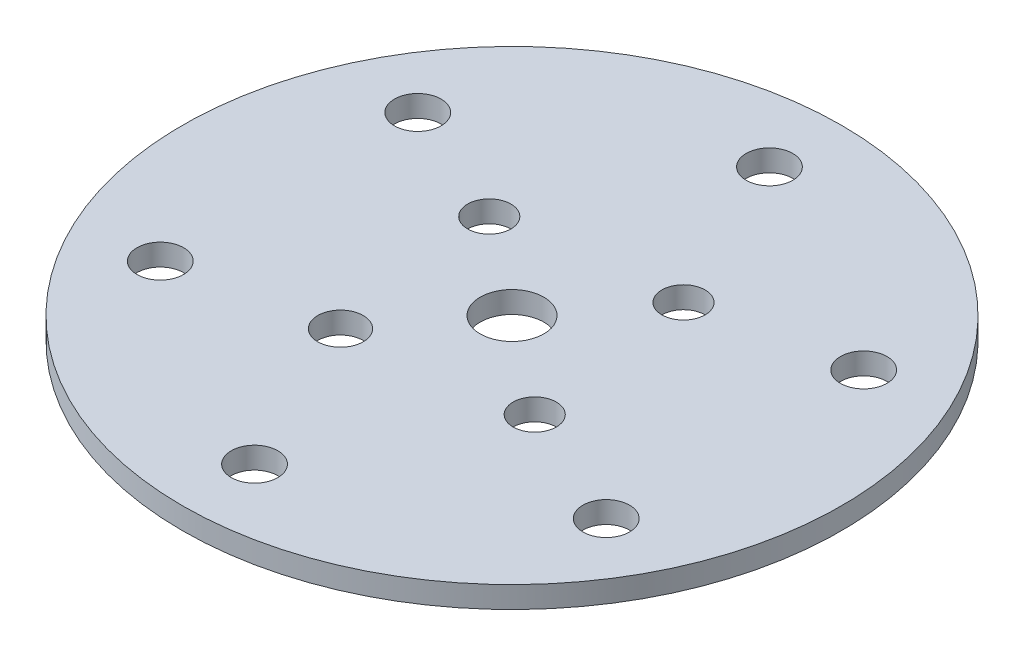
ISO-10303-21;
HEADER;
FILE_DESCRIPTION(('STEP AP214'),'2;1');
FILE_NAME('part.step','',(''),(''),'','','');
FILE_SCHEMA(('AUTOMOTIVE_DESIGN { 1 0 10303 214 1 1 1 1 }'));
ENDSEC;
DATA;
#1=APPLICATION_CONTEXT('core data for automotive mechanical design processes');
#2=APPLICATION_PROTOCOL_DEFINITION('international standard','automotive_design',2000,#1);
#3=PRODUCT_CONTEXT('',#1,'mechanical');
#4=PRODUCT('Part','Part','',(#3));
#5=PRODUCT_RELATED_PRODUCT_CATEGORY('part','',(#4));
#6=PRODUCT_DEFINITION_FORMATION('','',#4);
#7=PRODUCT_DEFINITION_CONTEXT('part definition',#1,'design');
#8=PRODUCT_DEFINITION('design','',#6,#7);
#9=PRODUCT_DEFINITION_SHAPE('','',#8);
#10=(LENGTH_UNIT() NAMED_UNIT(*) SI_UNIT(.MILLI.,.METRE.));
#11=(NAMED_UNIT(*) PLANE_ANGLE_UNIT() SI_UNIT($,.RADIAN.));
#12=(NAMED_UNIT(*) SI_UNIT($,.STERADIAN.) SOLID_ANGLE_UNIT());
#13=UNCERTAINTY_MEASURE_WITH_UNIT(LENGTH_MEASURE(1.E-05),#10,'distance_accuracy_value','');
#14=(GEOMETRIC_REPRESENTATION_CONTEXT(3) GLOBAL_UNCERTAINTY_ASSIGNED_CONTEXT((#13)) GLOBAL_UNIT_ASSIGNED_CONTEXT((#10,
#11,#12)) REPRESENTATION_CONTEXT('',''));
#15=CARTESIAN_POINT('',(0.,0.,0.));
#16=DIRECTION('',(0.,0.,1.));
#17=DIRECTION('',(1.,0.,0.));
#18=AXIS2_PLACEMENT_3D('',#15,#16,#17);
#19=CARTESIAN_POINT('',(0.,2.,0.));
#20=DIRECTION('',(0.,1.,0.));
#21=DIRECTION('',(0.,0.,1.));
#22=AXIS2_PLACEMENT_3D('',#19,#20,#21);
#23=PLANE('',#22);
#24=CARTESIAN_POINT('',(8.9816894035236,2.,6.87962611329007));
#25=DIRECTION('',(0.,1.,0.));
#26=DIRECTION('',(0.,0.,1.));
#27=AXIS2_PLACEMENT_3D('',#24,#25,#26);
#28=CIRCLE('',#27,2.);
#29=CARTESIAN_POINT('',(8.9816894035236,2.,8.87962611329007));
#30=VERTEX_POINT('',#29);
#31=EDGE_CURVE('E95',#30,#30,#28,.T.);
#32=ORIENTED_EDGE('',*,*,#31,.F.);
#33=EDGE_LOOP('',(#32));
#34=FACE_BOUND('',#33,.T.);
#35=CARTESIAN_POINT('',(-8.98168940352184,2.,-6.87962611328791));
#36=DIRECTION('',(0.,1.,0.));
#37=DIRECTION('',(0.,0.,1.));
#38=AXIS2_PLACEMENT_3D('',#35,#36,#37);
#39=CIRCLE('',#38,2.00000000000001);
#40=CARTESIAN_POINT('',(-8.98168940352184,2.,-4.8796261132879));
#41=VERTEX_POINT('',#40);
#42=EDGE_CURVE('E83',#41,#41,#39,.T.);
#43=ORIENTED_EDGE('',*,*,#42,.F.);
#44=EDGE_LOOP('',(#43));
#45=FACE_BOUND('',#44,.T.);
#46=CARTESIAN_POINT('',(-20.6222299276169,2.,11.90625));
#47=DIRECTION('',(0.,1.,0.));
#48=DIRECTION('',(0.,0.,1.));
#49=AXIS2_PLACEMENT_3D('',#46,#47,#48);
#50=CIRCLE('',#49,2.15265);
#51=CARTESIAN_POINT('',(-20.6222299276169,2.,14.0589));
#52=VERTEX_POINT('',#51);
#53=EDGE_CURVE('E71',#52,#52,#50,.T.);
#54=ORIENTED_EDGE('',*,*,#53,.F.);
#55=EDGE_LOOP('',(#54));
#56=FACE_BOUND('',#55,.T.);
#57=CARTESIAN_POINT('',(0.,2.,-23.8125));
#58=DIRECTION('',(0.,1.,0.));
#59=DIRECTION('',(0.,0.,1.));
#60=AXIS2_PLACEMENT_3D('',#57,#58,#59);
#61=CIRCLE('',#60,2.15265);
#62=CARTESIAN_POINT('',(0.,2.,-21.65985));
#63=VERTEX_POINT('',#62);
#64=EDGE_CURVE('E59',#63,#63,#61,.T.);
#65=ORIENTED_EDGE('',*,*,#64,.F.);
#66=EDGE_LOOP('',(#65));
#67=FACE_BOUND('',#66,.T.);
#68=CARTESIAN_POINT('',(20.622229927617,2.,11.9062499999998));
#69=DIRECTION('',(0.,1.,0.));
#70=DIRECTION('',(0.,0.,1.));
#71=AXIS2_PLACEMENT_3D('',#68,#69,#70);
#72=CIRCLE('',#71,2.15265);
#73=CARTESIAN_POINT('',(20.622229927617,2.,14.0588999999998));
#74=VERTEX_POINT('',#73);
#75=EDGE_CURVE('E47',#74,#74,#72,.T.);
#76=ORIENTED_EDGE('',*,*,#75,.F.);
#77=EDGE_LOOP('',(#76));
#78=FACE_BOUND('',#77,.T.);
#79=CARTESIAN_POINT('',(0.,2.,0.));
#80=DIRECTION('',(0.,1.,0.));
#81=DIRECTION('',(0.,0.,1.));
#82=AXIS2_PLACEMENT_3D('',#79,#80,#81);
#83=CIRCLE('',#82,30.48);
#84=CARTESIAN_POINT('',(0.,2.,30.48));
#85=VERTEX_POINT('',#84);
#86=EDGE_CURVE('E10',#85,#85,#83,.T.);
#87=ORIENTED_EDGE('',*,*,#86,.T.);
#88=EDGE_LOOP('',(#87));
#89=FACE_BOUND('',#88,.T.);
#90=CARTESIAN_POINT('',(0.,2.,23.8125));
#91=DIRECTION('',(0.,1.,0.));
#92=DIRECTION('',(0.,0.,1.));
#93=AXIS2_PLACEMENT_3D('',#90,#91,#92);
#94=CIRCLE('',#93,2.15265);
#95=CARTESIAN_POINT('',(0.,2.,25.96515));
#96=VERTEX_POINT('',#95);
#97=EDGE_CURVE('E42',#96,#96,#94,.T.);
#98=ORIENTED_EDGE('',*,*,#97,.F.);
#99=EDGE_LOOP('',(#98));
#100=FACE_BOUND('',#99,.T.);
#101=CARTESIAN_POINT('',(20.6222299276168,2.,-11.9062500000002));
#102=DIRECTION('',(0.,1.,0.));
#103=DIRECTION('',(0.,0.,1.));
#104=AXIS2_PLACEMENT_3D('',#101,#102,#103);
#105=CIRCLE('',#104,2.15265);
#106=CARTESIAN_POINT('',(20.6222299276168,2.,-9.75360000000024));
#107=VERTEX_POINT('',#106);
#108=EDGE_CURVE('E53',#107,#107,#105,.T.);
#109=ORIENTED_EDGE('',*,*,#108,.F.);
#110=EDGE_LOOP('',(#109));
#111=FACE_BOUND('',#110,.T.);
#112=CARTESIAN_POINT('',(-20.6222299276169,2.,-11.90625));
#113=DIRECTION('',(0.,1.,0.));
#114=DIRECTION('',(0.,0.,1.));
#115=AXIS2_PLACEMENT_3D('',#112,#113,#114);
#116=CIRCLE('',#115,2.15265);
#117=CARTESIAN_POINT('',(-20.6222299276169,2.,-9.7536));
#118=VERTEX_POINT('',#117);
#119=EDGE_CURVE('E65',#118,#118,#116,.T.);
#120=ORIENTED_EDGE('',*,*,#119,.F.);
#121=EDGE_LOOP('',(#120));
#122=FACE_BOUND('',#121,.T.);
#123=CARTESIAN_POINT('',(0.,2.,0.));
#124=DIRECTION('',(0.,1.,0.));
#125=DIRECTION('',(0.,0.,1.));
#126=AXIS2_PLACEMENT_3D('',#123,#124,#125);
#127=CIRCLE('',#126,2.94532370006392);
#128=CARTESIAN_POINT('',(0.,2.,2.94532370006392));
#129=VERTEX_POINT('',#128);
#130=EDGE_CURVE('E77',#129,#129,#127,.T.);
#131=ORIENTED_EDGE('',*,*,#130,.F.);
#132=EDGE_LOOP('',(#131));
#133=FACE_BOUND('',#132,.T.);
#134=CARTESIAN_POINT('',(6.87962611328987,2.,-8.98168940352164));
#135=DIRECTION('',(0.,1.,0.));
#136=DIRECTION('',(0.,0.,1.));
#137=AXIS2_PLACEMENT_3D('',#134,#135,#136);
#138=CIRCLE('',#137,2.);
#139=CARTESIAN_POINT('',(6.87962611328987,2.,-6.98168940352164));
#140=VERTEX_POINT('',#139);
#141=EDGE_CURVE('E89',#140,#140,#138,.T.);
#142=ORIENTED_EDGE('',*,*,#141,.F.);
#143=EDGE_LOOP('',(#142));
#144=FACE_BOUND('',#143,.T.);
#145=CARTESIAN_POINT('',(-6.8796261132881,2.,8.98168940352379));
#146=DIRECTION('',(0.,1.,0.));
#147=DIRECTION('',(0.,0.,1.));
#148=AXIS2_PLACEMENT_3D('',#145,#146,#147);
#149=CIRCLE('',#148,2.10499005802713);
#150=CARTESIAN_POINT('',(-6.8796261132881,2.,11.0866794615509));
#151=VERTEX_POINT('',#150);
#152=EDGE_CURVE('E101',#151,#151,#149,.T.);
#153=ORIENTED_EDGE('',*,*,#152,.F.);
#154=EDGE_LOOP('',(#153));
#155=FACE_BOUND('',#154,.T.);
#156=ADVANCED_FACE('F31',(#34,#45,#56,#67,#78,#89,#100,#111,#122,#133,#144,#155),#23,.T.);
#157=CARTESIAN_POINT('',(0.,0.,0.));
#158=DIRECTION('',(0.,1.,0.));
#159=DIRECTION('',(0.,0.,1.));
#160=AXIS2_PLACEMENT_3D('',#157,#158,#159);
#161=PLANE('',#160);
#162=CARTESIAN_POINT('',(0.,0.,0.));
#163=DIRECTION('',(0.,1.,0.));
#164=DIRECTION('',(0.,0.,1.));
#165=AXIS2_PLACEMENT_3D('',#162,#163,#164);
#166=CIRCLE('',#165,30.48);
#167=CARTESIAN_POINT('',(0.,0.,30.48));
#168=VERTEX_POINT('',#167);
#169=EDGE_CURVE('E35',#168,#168,#166,.T.);
#170=ORIENTED_EDGE('',*,*,#169,.F.);
#171=EDGE_LOOP('',(#170));
#172=FACE_BOUND('',#171,.T.);
#173=CARTESIAN_POINT('',(0.,0.,23.8125));
#174=DIRECTION('',(0.,1.,0.));
#175=DIRECTION('',(0.,0.,1.));
#176=AXIS2_PLACEMENT_3D('',#173,#174,#175);
#177=CIRCLE('',#176,2.15265);
#178=CARTESIAN_POINT('',(0.,0.,25.96515));
#179=VERTEX_POINT('',#178);
#180=EDGE_CURVE('E44',#179,#179,#177,.T.);
#181=ORIENTED_EDGE('',*,*,#180,.T.);
#182=EDGE_LOOP('',(#181));
#183=FACE_BOUND('',#182,.T.);
#184=CARTESIAN_POINT('',(20.622229927617,0.,11.9062499999998));
#185=DIRECTION('',(0.,1.,0.));
#186=DIRECTION('',(0.,0.,1.));
#187=AXIS2_PLACEMENT_3D('',#184,#185,#186);
#188=CIRCLE('',#187,2.15265);
#189=CARTESIAN_POINT('',(20.622229927617,0.,14.0588999999998));
#190=VERTEX_POINT('',#189);
#191=EDGE_CURVE('E50',#190,#190,#188,.T.);
#192=ORIENTED_EDGE('',*,*,#191,.T.);
#193=EDGE_LOOP('',(#192));
#194=FACE_BOUND('',#193,.T.);
#195=CARTESIAN_POINT('',(20.6222299276168,0.,-11.9062500000002));
#196=DIRECTION('',(0.,1.,0.));
#197=DIRECTION('',(0.,0.,1.));
#198=AXIS2_PLACEMENT_3D('',#195,#196,#197);
#199=CIRCLE('',#198,2.15265);
#200=CARTESIAN_POINT('',(20.6222299276168,0.,-9.75360000000024));
#201=VERTEX_POINT('',#200);
#202=EDGE_CURVE('E56',#201,#201,#199,.T.);
#203=ORIENTED_EDGE('',*,*,#202,.T.);
#204=EDGE_LOOP('',(#203));
#205=FACE_BOUND('',#204,.T.);
#206=CARTESIAN_POINT('',(0.,0.,-23.8125));
#207=DIRECTION('',(0.,1.,0.));
#208=DIRECTION('',(0.,0.,1.));
#209=AXIS2_PLACEMENT_3D('',#206,#207,#208);
#210=CIRCLE('',#209,2.15265);
#211=CARTESIAN_POINT('',(0.,0.,-21.65985));
#212=VERTEX_POINT('',#211);
#213=EDGE_CURVE('E62',#212,#212,#210,.T.);
#214=ORIENTED_EDGE('',*,*,#213,.T.);
#215=EDGE_LOOP('',(#214));
#216=FACE_BOUND('',#215,.T.);
#217=CARTESIAN_POINT('',(-20.6222299276169,0.,-11.90625));
#218=DIRECTION('',(0.,1.,0.));
#219=DIRECTION('',(0.,0.,1.));
#220=AXIS2_PLACEMENT_3D('',#217,#218,#219);
#221=CIRCLE('',#220,2.15265);
#222=CARTESIAN_POINT('',(-20.6222299276169,0.,-9.7536));
#223=VERTEX_POINT('',#222);
#224=EDGE_CURVE('E68',#223,#223,#221,.T.);
#225=ORIENTED_EDGE('',*,*,#224,.T.);
#226=EDGE_LOOP('',(#225));
#227=FACE_BOUND('',#226,.T.);
#228=CARTESIAN_POINT('',(-20.6222299276169,0.,11.90625));
#229=DIRECTION('',(0.,1.,0.));
#230=DIRECTION('',(0.,0.,1.));
#231=AXIS2_PLACEMENT_3D('',#228,#229,#230);
#232=CIRCLE('',#231,2.15265);
#233=CARTESIAN_POINT('',(-20.6222299276169,0.,14.0589));
#234=VERTEX_POINT('',#233);
#235=EDGE_CURVE('E74',#234,#234,#232,.T.);
#236=ORIENTED_EDGE('',*,*,#235,.T.);
#237=EDGE_LOOP('',(#236));
#238=FACE_BOUND('',#237,.T.);
#239=CARTESIAN_POINT('',(0.,0.,0.));
#240=DIRECTION('',(0.,1.,0.));
#241=DIRECTION('',(0.,0.,1.));
#242=AXIS2_PLACEMENT_3D('',#239,#240,#241);
#243=CIRCLE('',#242,2.94532370006392);
#244=CARTESIAN_POINT('',(0.,0.,2.94532370006392));
#245=VERTEX_POINT('',#244);
#246=EDGE_CURVE('E80',#245,#245,#243,.T.);
#247=ORIENTED_EDGE('',*,*,#246,.T.);
#248=EDGE_LOOP('',(#247));
#249=FACE_BOUND('',#248,.T.);
#250=CARTESIAN_POINT('',(-8.98168940352184,0.,-6.87962611328791));
#251=DIRECTION('',(0.,1.,0.));
#252=DIRECTION('',(0.,0.,1.));
#253=AXIS2_PLACEMENT_3D('',#250,#251,#252);
#254=CIRCLE('',#253,2.00000000000001);
#255=CARTESIAN_POINT('',(-8.98168940352184,0.,-4.8796261132879));
#256=VERTEX_POINT('',#255);
#257=EDGE_CURVE('E86',#256,#256,#254,.T.);
#258=ORIENTED_EDGE('',*,*,#257,.T.);
#259=EDGE_LOOP('',(#258));
#260=FACE_BOUND('',#259,.T.);
#261=CARTESIAN_POINT('',(6.87962611328987,0.,-8.98168940352164));
#262=DIRECTION('',(0.,1.,0.));
#263=DIRECTION('',(0.,0.,1.));
#264=AXIS2_PLACEMENT_3D('',#261,#262,#263);
#265=CIRCLE('',#264,2.);
#266=CARTESIAN_POINT('',(6.87962611328987,0.,-6.98168940352164));
#267=VERTEX_POINT('',#266);
#268=EDGE_CURVE('E92',#267,#267,#265,.T.);
#269=ORIENTED_EDGE('',*,*,#268,.T.);
#270=EDGE_LOOP('',(#269));
#271=FACE_BOUND('',#270,.T.);
#272=CARTESIAN_POINT('',(8.9816894035236,0.,6.87962611329007));
#273=DIRECTION('',(0.,1.,0.));
#274=DIRECTION('',(0.,0.,1.));
#275=AXIS2_PLACEMENT_3D('',#272,#273,#274);
#276=CIRCLE('',#275,2.);
#277=CARTESIAN_POINT('',(8.9816894035236,0.,8.87962611329007));
#278=VERTEX_POINT('',#277);
#279=EDGE_CURVE('E98',#278,#278,#276,.T.);
#280=ORIENTED_EDGE('',*,*,#279,.T.);
#281=EDGE_LOOP('',(#280));
#282=FACE_BOUND('',#281,.T.);
#283=CARTESIAN_POINT('',(-6.8796261132881,0.,8.98168940352379));
#284=DIRECTION('',(0.,1.,0.));
#285=DIRECTION('',(0.,0.,1.));
#286=AXIS2_PLACEMENT_3D('',#283,#284,#285);
#287=CIRCLE('',#286,2.10499005802713);
#288=CARTESIAN_POINT('',(-6.8796261132881,0.,11.0866794615509));
#289=VERTEX_POINT('',#288);
#290=EDGE_CURVE('E104',#289,#289,#287,.T.);
#291=ORIENTED_EDGE('',*,*,#290,.T.);
#292=EDGE_LOOP('',(#291));
#293=FACE_BOUND('',#292,.T.);
#294=ADVANCED_FACE('F114',(#172,#183,#194,#205,#216,#227,#238,#249,#260,#271,#282,#293),#161,.F.);
#295=CARTESIAN_POINT('',(0.,2.,0.));
#296=DIRECTION('',(0.,-1.,0.));
#297=DIRECTION('',(0.,0.,-1.));
#298=AXIS2_PLACEMENT_3D('',#295,#296,#297);
#299=CYLINDRICAL_SURFACE('',#298,30.48);
#300=ORIENTED_EDGE('',*,*,#86,.F.);
#301=EDGE_LOOP('',(#300));
#302=FACE_BOUND('',#301,.T.);
#303=ORIENTED_EDGE('',*,*,#169,.T.);
#304=EDGE_LOOP('',(#303));
#305=FACE_BOUND('',#304,.T.);
#306=ADVANCED_FACE('F33',(#302,#305),#299,.T.);
#307=CARTESIAN_POINT('',(0.,2.,23.8125));
#308=DIRECTION('',(0.,-1.,0.));
#309=DIRECTION('',(0.,0.,-1.));
#310=AXIS2_PLACEMENT_3D('',#307,#308,#309);
#311=CYLINDRICAL_SURFACE('',#310,2.15265);
#312=ORIENTED_EDGE('',*,*,#97,.T.);
#313=EDGE_LOOP('',(#312));
#314=FACE_BOUND('',#313,.T.);
#315=ORIENTED_EDGE('',*,*,#180,.F.);
#316=EDGE_LOOP('',(#315));
#317=FACE_BOUND('',#316,.T.);
#318=ADVANCED_FACE('F124',(#314,#317),#311,.F.);
#319=CARTESIAN_POINT('',(20.622229927617,2.,11.9062499999998));
#320=DIRECTION('',(0.,-1.,0.));
#321=DIRECTION('',(0.,0.,-1.));
#322=AXIS2_PLACEMENT_3D('',#319,#320,#321);
#323=CYLINDRICAL_SURFACE('',#322,2.15265);
#324=ORIENTED_EDGE('',*,*,#75,.T.);
#325=EDGE_LOOP('',(#324));
#326=FACE_BOUND('',#325,.T.);
#327=ORIENTED_EDGE('',*,*,#191,.F.);
#328=EDGE_LOOP('',(#327));
#329=FACE_BOUND('',#328,.T.);
#330=ADVANCED_FACE('F127',(#326,#329),#323,.F.);
#331=CARTESIAN_POINT('',(20.6222299276168,2.,-11.9062500000002));
#332=DIRECTION('',(0.,-1.,0.));
#333=DIRECTION('',(0.,0.,-1.));
#334=AXIS2_PLACEMENT_3D('',#331,#332,#333);
#335=CYLINDRICAL_SURFACE('',#334,2.15265);
#336=ORIENTED_EDGE('',*,*,#108,.T.);
#337=EDGE_LOOP('',(#336));
#338=FACE_BOUND('',#337,.T.);
#339=ORIENTED_EDGE('',*,*,#202,.F.);
#340=EDGE_LOOP('',(#339));
#341=FACE_BOUND('',#340,.T.);
#342=ADVANCED_FACE('F131',(#338,#341),#335,.F.);
#343=CARTESIAN_POINT('',(0.,2.,-23.8125));
#344=DIRECTION('',(0.,-1.,0.));
#345=DIRECTION('',(0.,0.,-1.));
#346=AXIS2_PLACEMENT_3D('',#343,#344,#345);
#347=CYLINDRICAL_SURFACE('',#346,2.15265);
#348=ORIENTED_EDGE('',*,*,#64,.T.);
#349=EDGE_LOOP('',(#348));
#350=FACE_BOUND('',#349,.T.);
#351=ORIENTED_EDGE('',*,*,#213,.F.);
#352=EDGE_LOOP('',(#351));
#353=FACE_BOUND('',#352,.T.);
#354=ADVANCED_FACE('F135',(#350,#353),#347,.F.);
#355=CARTESIAN_POINT('',(-20.6222299276169,2.,-11.90625));
#356=DIRECTION('',(0.,-1.,0.));
#357=DIRECTION('',(0.,0.,-1.));
#358=AXIS2_PLACEMENT_3D('',#355,#356,#357);
#359=CYLINDRICAL_SURFACE('',#358,2.15265);
#360=ORIENTED_EDGE('',*,*,#119,.T.);
#361=EDGE_LOOP('',(#360));
#362=FACE_BOUND('',#361,.T.);
#363=ORIENTED_EDGE('',*,*,#224,.F.);
#364=EDGE_LOOP('',(#363));
#365=FACE_BOUND('',#364,.T.);
#366=ADVANCED_FACE('F139',(#362,#365),#359,.F.);
#367=CARTESIAN_POINT('',(-20.6222299276169,2.,11.90625));
#368=DIRECTION('',(0.,-1.,0.));
#369=DIRECTION('',(0.,0.,-1.));
#370=AXIS2_PLACEMENT_3D('',#367,#368,#369);
#371=CYLINDRICAL_SURFACE('',#370,2.15265);
#372=ORIENTED_EDGE('',*,*,#53,.T.);
#373=EDGE_LOOP('',(#372));
#374=FACE_BOUND('',#373,.T.);
#375=ORIENTED_EDGE('',*,*,#235,.F.);
#376=EDGE_LOOP('',(#375));
#377=FACE_BOUND('',#376,.T.);
#378=ADVANCED_FACE('F143',(#374,#377),#371,.F.);
#379=CARTESIAN_POINT('',(0.,2.,0.));
#380=DIRECTION('',(0.,-1.,0.));
#381=DIRECTION('',(0.,0.,-1.));
#382=AXIS2_PLACEMENT_3D('',#379,#380,#381);
#383=CYLINDRICAL_SURFACE('',#382,2.94532370006392);
#384=ORIENTED_EDGE('',*,*,#130,.T.);
#385=EDGE_LOOP('',(#384));
#386=FACE_BOUND('',#385,.T.);
#387=ORIENTED_EDGE('',*,*,#246,.F.);
#388=EDGE_LOOP('',(#387));
#389=FACE_BOUND('',#388,.T.);
#390=ADVANCED_FACE('F147',(#386,#389),#383,.F.);
#391=CARTESIAN_POINT('',(-8.98168940352184,2.,-6.87962611328791));
#392=DIRECTION('',(0.,-1.,0.));
#393=DIRECTION('',(0.,0.,-1.));
#394=AXIS2_PLACEMENT_3D('',#391,#392,#393);
#395=CYLINDRICAL_SURFACE('',#394,2.00000000000001);
#396=ORIENTED_EDGE('',*,*,#42,.T.);
#397=EDGE_LOOP('',(#396));
#398=FACE_BOUND('',#397,.T.);
#399=ORIENTED_EDGE('',*,*,#257,.F.);
#400=EDGE_LOOP('',(#399));
#401=FACE_BOUND('',#400,.T.);
#402=ADVANCED_FACE('F151',(#398,#401),#395,.F.);
#403=CARTESIAN_POINT('',(6.87962611328987,2.,-8.98168940352164));
#404=DIRECTION('',(0.,-1.,0.));
#405=DIRECTION('',(0.,0.,-1.));
#406=AXIS2_PLACEMENT_3D('',#403,#404,#405);
#407=CYLINDRICAL_SURFACE('',#406,2.);
#408=ORIENTED_EDGE('',*,*,#141,.T.);
#409=EDGE_LOOP('',(#408));
#410=FACE_BOUND('',#409,.T.);
#411=ORIENTED_EDGE('',*,*,#268,.F.);
#412=EDGE_LOOP('',(#411));
#413=FACE_BOUND('',#412,.T.);
#414=ADVANCED_FACE('F155',(#410,#413),#407,.F.);
#415=CARTESIAN_POINT('',(8.9816894035236,2.,6.87962611329007));
#416=DIRECTION('',(0.,-1.,0.));
#417=DIRECTION('',(0.,0.,-1.));
#418=AXIS2_PLACEMENT_3D('',#415,#416,#417);
#419=CYLINDRICAL_SURFACE('',#418,2.);
#420=ORIENTED_EDGE('',*,*,#31,.T.);
#421=EDGE_LOOP('',(#420));
#422=FACE_BOUND('',#421,.T.);
#423=ORIENTED_EDGE('',*,*,#279,.F.);
#424=EDGE_LOOP('',(#423));
#425=FACE_BOUND('',#424,.T.);
#426=ADVANCED_FACE('F159',(#422,#425),#419,.F.);
#427=CARTESIAN_POINT('',(-6.8796261132881,2.,8.98168940352379));
#428=DIRECTION('',(0.,-1.,0.));
#429=DIRECTION('',(0.,0.,-1.));
#430=AXIS2_PLACEMENT_3D('',#427,#428,#429);
#431=CYLINDRICAL_SURFACE('',#430,2.10499005802713);
#432=ORIENTED_EDGE('',*,*,#152,.T.);
#433=EDGE_LOOP('',(#432));
#434=FACE_BOUND('',#433,.T.);
#435=ORIENTED_EDGE('',*,*,#290,.F.);
#436=EDGE_LOOP('',(#435));
#437=FACE_BOUND('',#436,.T.);
#438=ADVANCED_FACE('F110',(#434,#437),#431,.F.);
#439=CLOSED_SHELL('',(#156,#294,#306,#318,#330,#342,#354,#366,#378,#390,#402,#414,#426,#438));
#440=MANIFOLD_SOLID_BREP('B2',#439);
#441=ADVANCED_BREP_SHAPE_REPRESENTATION('',(#18,#440),#14);
#442=SHAPE_DEFINITION_REPRESENTATION(#9,#441);
ENDSEC;
END-ISO-10303-21;
